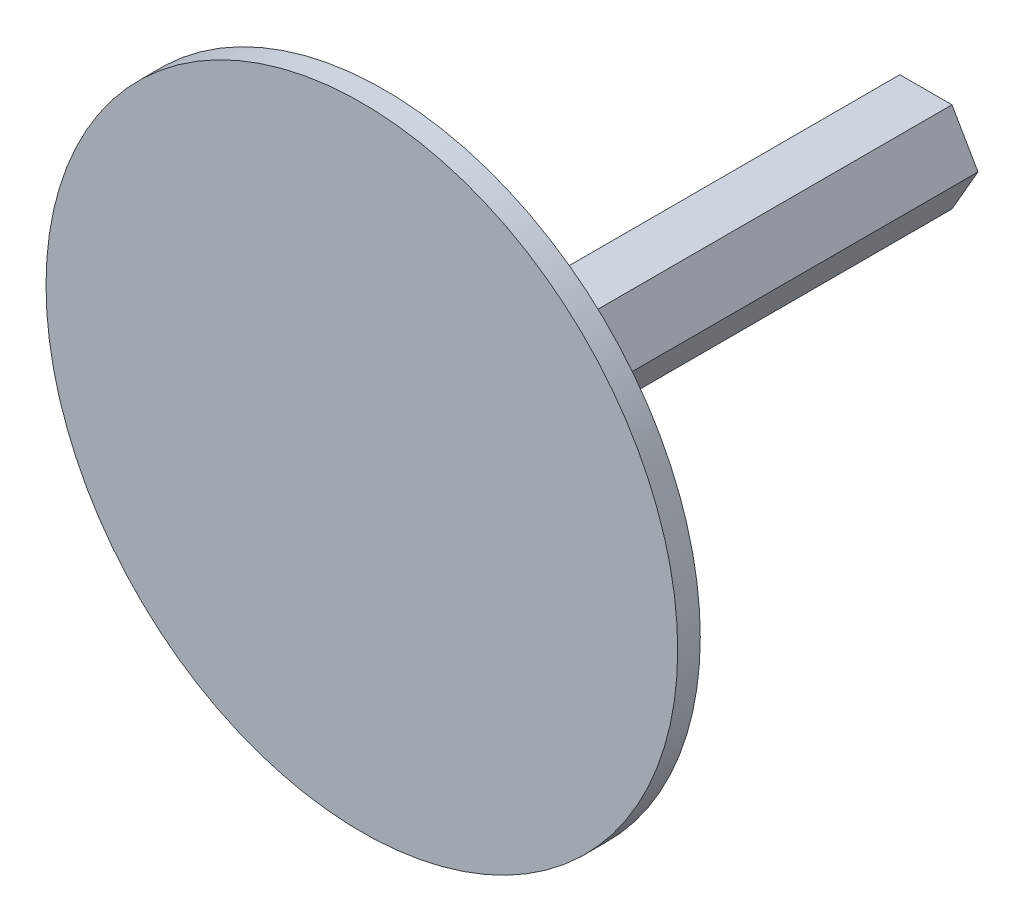
ISO-10303-21;
HEADER;
FILE_DESCRIPTION(('STEP AP214'),'2;1');
FILE_NAME('part.step','',(''),(''),'','','');
FILE_SCHEMA(('AUTOMOTIVE_DESIGN { 1 0 10303 214 1 1 1 1 }'));
ENDSEC;
DATA;
#1=APPLICATION_CONTEXT('core data for automotive mechanical design processes');
#2=APPLICATION_PROTOCOL_DEFINITION('international standard','automotive_design',2000,#1);
#3=PRODUCT_CONTEXT('',#1,'mechanical');
#4=PRODUCT('Part','Part','',(#3));
#5=PRODUCT_RELATED_PRODUCT_CATEGORY('part','',(#4));
#6=PRODUCT_DEFINITION_FORMATION('','',#4);
#7=PRODUCT_DEFINITION_CONTEXT('part definition',#1,'design');
#8=PRODUCT_DEFINITION('design','',#6,#7);
#9=PRODUCT_DEFINITION_SHAPE('','',#8);
#10=(LENGTH_UNIT() NAMED_UNIT(*) SI_UNIT(.MILLI.,.METRE.));
#11=(NAMED_UNIT(*) PLANE_ANGLE_UNIT() SI_UNIT($,.RADIAN.));
#12=(NAMED_UNIT(*) SI_UNIT($,.STERADIAN.) SOLID_ANGLE_UNIT());
#13=UNCERTAINTY_MEASURE_WITH_UNIT(LENGTH_MEASURE(1.E-05),#10,'distance_accuracy_value','');
#14=(GEOMETRIC_REPRESENTATION_CONTEXT(3) GLOBAL_UNCERTAINTY_ASSIGNED_CONTEXT((#13)) GLOBAL_UNIT_ASSIGNED_CONTEXT((#10,
#11,#12)) REPRESENTATION_CONTEXT('',''));
#15=CARTESIAN_POINT('',(0.,0.,0.));
#16=DIRECTION('',(0.,0.,1.));
#17=DIRECTION('',(1.,0.,0.));
#18=AXIS2_PLACEMENT_3D('',#15,#16,#17);
#19=CARTESIAN_POINT('',(3.66617420935418,-6.34999999999993,-76.2));
#20=DIRECTION('',(0.866025403784442,-0.499999999999995,0.));
#21=DIRECTION('',(0.499999999999995,0.866025403784442,0.));
#22=AXIS2_PLACEMENT_3D('',#19,#20,#21);
#23=PLANE('',#22);
#24=DIRECTION('',(0.499999999999995,0.866025403784441,0.));
#25=VECTOR('',#24,1.);
#26=CARTESIAN_POINT('',(3.66617420935418,-6.34999999999993,0.));
#27=LINE('',#26,#25);
#28=CARTESIAN_POINT('',(3.66617420935418,-6.34999999999993,0.));
#29=VERTEX_POINT('',#28);
#30=CARTESIAN_POINT('',(7.33234841870822,0.,0.));
#31=VERTEX_POINT('',#30);
#32=EDGE_CURVE('E129',#29,#31,#27,.T.);
#33=ORIENTED_EDGE('',*,*,#32,.F.);
#34=DIRECTION('',(0.,0.,1.));
#35=VECTOR('',#34,1.);
#36=CARTESIAN_POINT('',(3.66617420935418,-6.34999999999993,-76.2));
#37=LINE('',#36,#35);
#38=CARTESIAN_POINT('',(3.66617420935418,-6.34999999999993,-76.2));
#39=VERTEX_POINT('',#38);
#40=EDGE_CURVE('E11',#39,#29,#37,.T.);
#41=ORIENTED_EDGE('',*,*,#40,.F.);
#42=DIRECTION('',(0.499999999999995,0.866025403784441,0.));
#43=VECTOR('',#42,1.);
#44=CARTESIAN_POINT('',(3.66617420935418,-6.34999999999993,-76.2));
#45=LINE('',#44,#43);
#46=CARTESIAN_POINT('',(7.33234841870822,0.,-76.2));
#47=VERTEX_POINT('',#46);
#48=EDGE_CURVE('E150',#39,#47,#45,.T.);
#49=ORIENTED_EDGE('',*,*,#48,.T.);
#50=DIRECTION('',(0.,0.,1.));
#51=VECTOR('',#50,1.);
#52=CARTESIAN_POINT('',(7.33234841870822,0.,-76.2));
#53=LINE('',#52,#51);
#54=EDGE_CURVE('E42',#47,#31,#53,.T.);
#55=ORIENTED_EDGE('',*,*,#54,.T.);
#56=EDGE_LOOP('',(#33,#41,#49,#55));
#57=FACE_BOUND('',#56,.T.);
#58=ADVANCED_FACE('F39',(#57),#23,.T.);
#59=CARTESIAN_POINT('',(-3.66617420935405,-6.35000000000001,-76.2));
#60=DIRECTION('',(0.,-1.,0.));
#61=DIRECTION('',(1.,0.,0.));
#62=AXIS2_PLACEMENT_3D('',#59,#60,#61);
#63=PLANE('',#62);
#64=DIRECTION('',(1.,0.,0.));
#65=VECTOR('',#64,1.);
#66=CARTESIAN_POINT('',(-3.66617420935405,-6.35000000000001,0.));
#67=LINE('',#66,#65);
#68=CARTESIAN_POINT('',(-3.66617420935405,-6.35000000000001,0.));
#69=VERTEX_POINT('',#68);
#70=EDGE_CURVE('E147',#69,#29,#67,.T.);
#71=ORIENTED_EDGE('',*,*,#70,.F.);
#72=DIRECTION('',(0.,0.,1.));
#73=VECTOR('',#72,1.);
#74=CARTESIAN_POINT('',(-3.66617420935405,-6.35000000000001,-76.2));
#75=LINE('',#74,#73);
#76=CARTESIAN_POINT('',(-3.66617420935405,-6.35000000000001,-76.2));
#77=VERTEX_POINT('',#76);
#78=EDGE_CURVE('E49',#77,#69,#75,.T.);
#79=ORIENTED_EDGE('',*,*,#78,.F.);
#80=DIRECTION('',(1.,0.,0.));
#81=VECTOR('',#80,1.);
#82=CARTESIAN_POINT('',(-3.66617420935405,-6.35000000000001,-76.2));
#83=LINE('',#82,#81);
#84=EDGE_CURVE('E115',#77,#39,#83,.T.);
#85=ORIENTED_EDGE('',*,*,#84,.T.);
#86=ORIENTED_EDGE('',*,*,#40,.T.);
#87=EDGE_LOOP('',(#71,#79,#85,#86));
#88=FACE_BOUND('',#87,.T.);
#89=ADVANCED_FACE('F163',(#88),#63,.T.);
#90=CARTESIAN_POINT('',(-7.33234841870822,0.,-76.2));
#91=DIRECTION('',(-0.866025403784435,-0.500000000000007,0.));
#92=DIRECTION('',(0.500000000000007,-0.866025403784435,0.));
#93=AXIS2_PLACEMENT_3D('',#90,#91,#92);
#94=PLANE('',#93);
#95=DIRECTION('',(0.500000000000007,-0.866025403784435,0.));
#96=VECTOR('',#95,1.);
#97=CARTESIAN_POINT('',(-7.33234841870822,0.,0.));
#98=LINE('',#97,#96);
#99=CARTESIAN_POINT('',(-7.33234841870822,0.,0.));
#100=VERTEX_POINT('',#99);
#101=EDGE_CURVE('E103',#100,#69,#98,.T.);
#102=ORIENTED_EDGE('',*,*,#101,.F.);
#103=DIRECTION('',(0.,0.,1.));
#104=VECTOR('',#103,1.);
#105=CARTESIAN_POINT('',(-7.33234841870822,0.,-76.2));
#106=LINE('',#105,#104);
#107=CARTESIAN_POINT('',(-7.33234841870822,0.,-76.2));
#108=VERTEX_POINT('',#107);
#109=EDGE_CURVE('E78',#108,#100,#106,.T.);
#110=ORIENTED_EDGE('',*,*,#109,.F.);
#111=DIRECTION('',(0.500000000000007,-0.866025403784435,0.));
#112=VECTOR('',#111,1.);
#113=CARTESIAN_POINT('',(-7.33234841870822,0.,-76.2));
#114=LINE('',#113,#112);
#115=EDGE_CURVE('E100',#108,#77,#114,.T.);
#116=ORIENTED_EDGE('',*,*,#115,.T.);
#117=ORIENTED_EDGE('',*,*,#78,.T.);
#118=EDGE_LOOP('',(#102,#110,#116,#117));
#119=FACE_BOUND('',#118,.T.);
#120=ADVANCED_FACE('F99',(#119),#94,.T.);
#121=CARTESIAN_POINT('',(-3.66617420935414,6.34999999999996,-76.2));
#122=DIRECTION('',(-0.866025403784442,0.499999999999995,0.));
#123=DIRECTION('',(-0.499999999999995,-0.866025403784442,0.));
#124=AXIS2_PLACEMENT_3D('',#121,#122,#123);
#125=PLANE('',#124);
#126=DIRECTION('',(-0.499999999999995,-0.866025403784441,0.));
#127=VECTOR('',#126,1.);
#128=CARTESIAN_POINT('',(-3.66617420935414,6.34999999999996,0.));
#129=LINE('',#128,#127);
#130=CARTESIAN_POINT('',(-3.66617420935414,6.34999999999996,0.));
#131=VERTEX_POINT('',#130);
#132=EDGE_CURVE('E142',#131,#100,#129,.T.);
#133=ORIENTED_EDGE('',*,*,#132,.F.);
#134=DIRECTION('',(0.,0.,1.));
#135=VECTOR('',#134,1.);
#136=CARTESIAN_POINT('',(-3.66617420935414,6.34999999999996,-76.2));
#137=LINE('',#136,#135);
#138=CARTESIAN_POINT('',(-3.66617420935414,6.34999999999996,-76.2));
#139=VERTEX_POINT('',#138);
#140=EDGE_CURVE('E106',#139,#131,#137,.T.);
#141=ORIENTED_EDGE('',*,*,#140,.F.);
#142=DIRECTION('',(-0.499999999999995,-0.866025403784441,0.));
#143=VECTOR('',#142,1.);
#144=CARTESIAN_POINT('',(-3.66617420935414,6.34999999999996,-76.2));
#145=LINE('',#144,#143);
#146=EDGE_CURVE('E112',#139,#108,#145,.T.);
#147=ORIENTED_EDGE('',*,*,#146,.T.);
#148=ORIENTED_EDGE('',*,*,#109,.T.);
#149=EDGE_LOOP('',(#133,#141,#147,#148));
#150=FACE_BOUND('',#149,.T.);
#151=ADVANCED_FACE('F118',(#150),#125,.T.);
#152=CARTESIAN_POINT('',(3.66617420935409,6.34999999999998,-76.2));
#153=DIRECTION('',(0.,1.,0.));
#154=DIRECTION('',(-1.,0.,0.));
#155=AXIS2_PLACEMENT_3D('',#152,#153,#154);
#156=PLANE('',#155);
#157=DIRECTION('',(-1.,0.,0.));
#158=VECTOR('',#157,1.);
#159=CARTESIAN_POINT('',(3.66617420935409,6.34999999999998,0.));
#160=LINE('',#159,#158);
#161=CARTESIAN_POINT('',(3.66617420935409,6.34999999999998,0.));
#162=VERTEX_POINT('',#161);
#163=EDGE_CURVE('E138',#162,#131,#160,.T.);
#164=ORIENTED_EDGE('',*,*,#163,.F.);
#165=DIRECTION('',(0.,0.,1.));
#166=VECTOR('',#165,1.);
#167=CARTESIAN_POINT('',(3.66617420935409,6.34999999999998,-76.2));
#168=LINE('',#167,#166);
#169=CARTESIAN_POINT('',(3.66617420935409,6.34999999999998,-76.2));
#170=VERTEX_POINT('',#169);
#171=EDGE_CURVE('E155',#170,#162,#168,.T.);
#172=ORIENTED_EDGE('',*,*,#171,.F.);
#173=DIRECTION('',(-1.,0.,0.));
#174=VECTOR('',#173,1.);
#175=CARTESIAN_POINT('',(3.66617420935409,6.34999999999998,-76.2));
#176=LINE('',#175,#174);
#177=EDGE_CURVE('E120',#170,#139,#176,.T.);
#178=ORIENTED_EDGE('',*,*,#177,.T.);
#179=ORIENTED_EDGE('',*,*,#140,.T.);
#180=EDGE_LOOP('',(#164,#172,#178,#179));
#181=FACE_BOUND('',#180,.T.);
#182=ADVANCED_FACE('F176',(#181),#156,.T.);
#183=CARTESIAN_POINT('',(7.33234841870822,0.,-76.2));
#184=DIRECTION('',(0.866025403784438,0.500000000000001,0.));
#185=DIRECTION('',(-0.500000000000001,0.866025403784438,0.));
#186=AXIS2_PLACEMENT_3D('',#183,#184,#185);
#187=PLANE('',#186);
#188=DIRECTION('',(-0.500000000000001,0.866025403784438,0.));
#189=VECTOR('',#188,1.);
#190=CARTESIAN_POINT('',(7.33234841870822,0.,0.));
#191=LINE('',#190,#189);
#192=EDGE_CURVE('E133',#31,#162,#191,.T.);
#193=ORIENTED_EDGE('',*,*,#192,.F.);
#194=ORIENTED_EDGE('',*,*,#54,.F.);
#195=DIRECTION('',(-0.500000000000001,0.866025403784438,0.));
#196=VECTOR('',#195,1.);
#197=CARTESIAN_POINT('',(7.33234841870822,0.,-76.2));
#198=LINE('',#197,#196);
#199=EDGE_CURVE('E123',#47,#170,#198,.T.);
#200=ORIENTED_EDGE('',*,*,#199,.T.);
#201=ORIENTED_EDGE('',*,*,#171,.T.);
#202=EDGE_LOOP('',(#193,#194,#200,#201));
#203=FACE_BOUND('',#202,.T.);
#204=ADVANCED_FACE('F159',(#203),#187,.T.);
#205=CARTESIAN_POINT('',(0.,0.,-76.2));
#206=DIRECTION('',(0.,0.,1.));
#207=DIRECTION('',(1.,0.,0.));
#208=AXIS2_PLACEMENT_3D('',#205,#206,#207);
#209=PLANE('',#208);
#210=ORIENTED_EDGE('',*,*,#48,.F.);
#211=ORIENTED_EDGE('',*,*,#84,.F.);
#212=ORIENTED_EDGE('',*,*,#115,.F.);
#213=ORIENTED_EDGE('',*,*,#146,.F.);
#214=ORIENTED_EDGE('',*,*,#177,.F.);
#215=ORIENTED_EDGE('',*,*,#199,.F.);
#216=EDGE_LOOP('',(#210,#211,#212,#213,#214,#215));
#217=FACE_BOUND('',#216,.T.);
#218=ADVANCED_FACE('F110',(#217),#209,.F.);
#219=CARTESIAN_POINT('',(0.,0.,0.));
#220=DIRECTION('',(0.,0.,1.));
#221=DIRECTION('',(1.,0.,0.));
#222=AXIS2_PLACEMENT_3D('',#219,#220,#221);
#223=PLANE('',#222);
#224=CARTESIAN_POINT('',(0.,0.,0.));
#225=DIRECTION('',(0.,0.,1.));
#226=DIRECTION('',(1.,0.,0.));
#227=AXIS2_PLACEMENT_3D('',#224,#225,#226);
#228=CIRCLE('',#227,44.45);
#229=CARTESIAN_POINT('',(44.45,0.,0.));
#230=VERTEX_POINT('',#229);
#231=EDGE_CURVE('E203',#230,#230,#228,.T.);
#232=ORIENTED_EDGE('',*,*,#231,.F.);
#233=EDGE_LOOP('',(#232));
#234=FACE_BOUND('',#233,.T.);
#235=ORIENTED_EDGE('',*,*,#70,.T.);
#236=ORIENTED_EDGE('',*,*,#32,.T.);
#237=ORIENTED_EDGE('',*,*,#192,.T.);
#238=ORIENTED_EDGE('',*,*,#163,.T.);
#239=ORIENTED_EDGE('',*,*,#132,.T.);
#240=ORIENTED_EDGE('',*,*,#101,.T.);
#241=EDGE_LOOP('',(#235,#236,#237,#238,#239,#240));
#242=FACE_BOUND('',#241,.T.);
#243=ADVANCED_FACE('F161',(#234,#242),#223,.F.);
#244=CARTESIAN_POINT('',(0.,0.,3.175));
#245=DIRECTION('',(0.,0.,-1.));
#246=DIRECTION('',(-1.,0.,0.));
#247=AXIS2_PLACEMENT_3D('',#244,#245,#246);
#248=CYLINDRICAL_SURFACE('',#247,44.45);
#249=CARTESIAN_POINT('',(0.,0.,3.175));
#250=DIRECTION('',(0.,0.,1.));
#251=DIRECTION('',(1.,0.,0.));
#252=AXIS2_PLACEMENT_3D('',#249,#250,#251);
#253=CIRCLE('',#252,44.45);
#254=CARTESIAN_POINT('',(44.45,0.,3.175));
#255=VERTEX_POINT('',#254);
#256=EDGE_CURVE('E134',#255,#255,#253,.T.);
#257=ORIENTED_EDGE('',*,*,#256,.F.);
#258=EDGE_LOOP('',(#257));
#259=FACE_BOUND('',#258,.T.);
#260=ORIENTED_EDGE('',*,*,#231,.T.);
#261=EDGE_LOOP('',(#260));
#262=FACE_BOUND('',#261,.T.);
#263=ADVANCED_FACE('F186',(#259,#262),#248,.T.);
#264=CARTESIAN_POINT('',(0.,0.,3.175));
#265=DIRECTION('',(0.,0.,1.));
#266=DIRECTION('',(1.,0.,0.));
#267=AXIS2_PLACEMENT_3D('',#264,#265,#266);
#268=PLANE('',#267);
#269=ORIENTED_EDGE('',*,*,#256,.T.);
#270=EDGE_LOOP('',(#269));
#271=FACE_BOUND('',#270,.T.);
#272=ADVANCED_FACE('F192',(#271),#268,.T.);
#273=CLOSED_SHELL('',(#58,#89,#120,#151,#182,#204,#218,#243,#263,#272));
#274=MANIFOLD_SOLID_BREP('B2',#273);
#275=ADVANCED_BREP_SHAPE_REPRESENTATION('',(#18,#274),#14);
#276=SHAPE_DEFINITION_REPRESENTATION(#9,#275);
ENDSEC;
END-ISO-10303-21;
